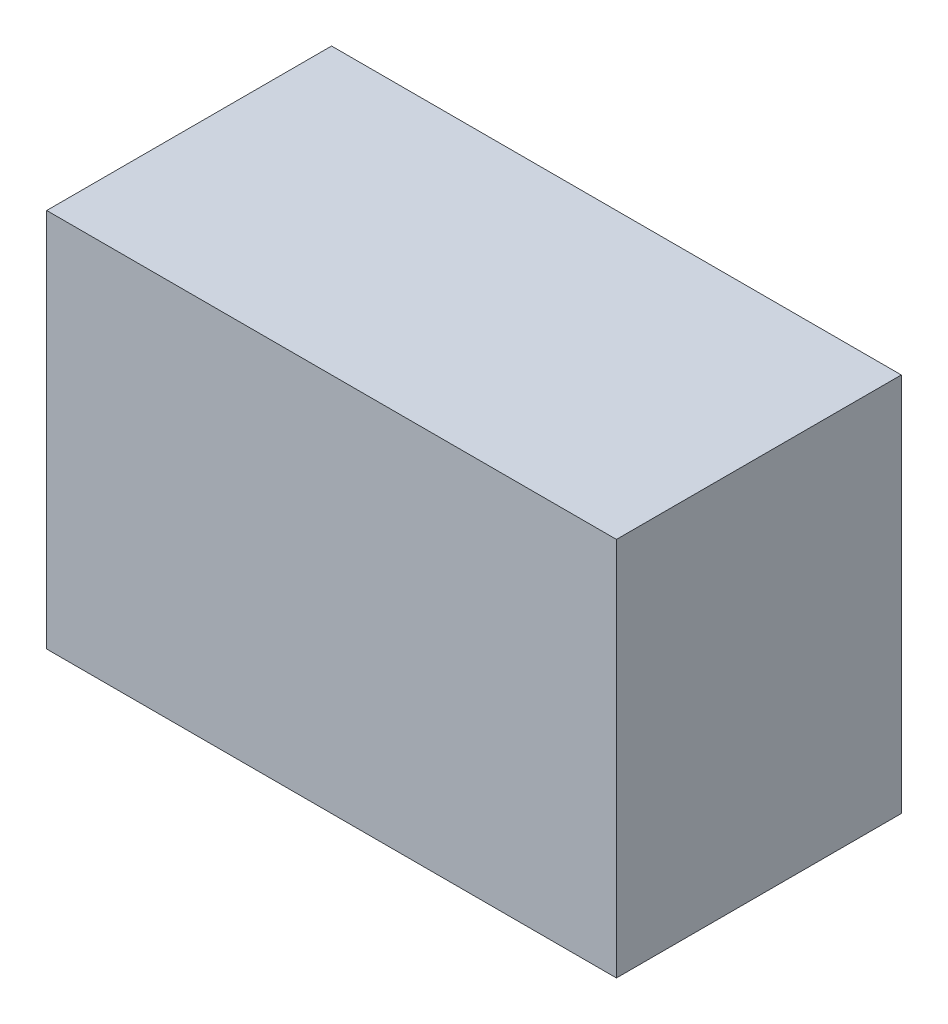
ISO-10303-21;
HEADER;
FILE_DESCRIPTION(('STEP AP214'),'2;1');
FILE_NAME('part.step','',(''),(''),'','','');
FILE_SCHEMA(('AUTOMOTIVE_DESIGN { 1 0 10303 214 1 1 1 1 }'));
ENDSEC;
DATA;
#1=APPLICATION_CONTEXT('core data for automotive mechanical design processes');
#2=APPLICATION_PROTOCOL_DEFINITION('international standard','automotive_design',2000,#1);
#3=PRODUCT_CONTEXT('',#1,'mechanical');
#4=PRODUCT('Part','Part','',(#3));
#5=PRODUCT_RELATED_PRODUCT_CATEGORY('part','',(#4));
#6=PRODUCT_DEFINITION_FORMATION('','',#4);
#7=PRODUCT_DEFINITION_CONTEXT('part definition',#1,'design');
#8=PRODUCT_DEFINITION('design','',#6,#7);
#9=PRODUCT_DEFINITION_SHAPE('','',#8);
#10=(LENGTH_UNIT() NAMED_UNIT(*) SI_UNIT(.MILLI.,.METRE.));
#11=(NAMED_UNIT(*) PLANE_ANGLE_UNIT() SI_UNIT($,.RADIAN.));
#12=(NAMED_UNIT(*) SI_UNIT($,.STERADIAN.) SOLID_ANGLE_UNIT());
#13=UNCERTAINTY_MEASURE_WITH_UNIT(LENGTH_MEASURE(1.E-05),#10,'distance_accuracy_value','');
#14=(GEOMETRIC_REPRESENTATION_CONTEXT(3) GLOBAL_UNCERTAINTY_ASSIGNED_CONTEXT((#13)) GLOBAL_UNIT_ASSIGNED_CONTEXT((#10,
#11,#12)) REPRESENTATION_CONTEXT('',''));
#15=CARTESIAN_POINT('',(0.,0.,0.));
#16=DIRECTION('',(0.,0.,1.));
#17=DIRECTION('',(1.,0.,0.));
#18=AXIS2_PLACEMENT_3D('',#15,#16,#17);
#19=CARTESIAN_POINT('',(0.,0.,3.));
#20=DIRECTION('',(1.,0.,0.));
#21=DIRECTION('',(0.,0.,-1.));
#22=AXIS2_PLACEMENT_3D('',#19,#20,#21);
#23=PLANE('',#22);
#24=DIRECTION('',(0.,-1.,0.));
#25=VECTOR('',#24,1.);
#26=CARTESIAN_POINT('',(0.,0.,0.));
#27=LINE('',#26,#25);
#28=CARTESIAN_POINT('',(0.,4.,0.));
#29=VERTEX_POINT('',#28);
#30=CARTESIAN_POINT('',(0.,0.,0.));
#31=VERTEX_POINT('',#30);
#32=EDGE_CURVE('E107',#29,#31,#27,.T.);
#33=ORIENTED_EDGE('',*,*,#32,.T.);
#34=DIRECTION('',(0.,0.,-1.));
#35=VECTOR('',#34,1.);
#36=CARTESIAN_POINT('',(0.,0.,3.));
#37=LINE('',#36,#35);
#38=CARTESIAN_POINT('',(0.,0.,3.));
#39=VERTEX_POINT('',#38);
#40=EDGE_CURVE('E11',#39,#31,#37,.T.);
#41=ORIENTED_EDGE('',*,*,#40,.F.);
#42=DIRECTION('',(0.,-1.,0.));
#43=VECTOR('',#42,1.);
#44=CARTESIAN_POINT('',(0.,0.,3.));
#45=LINE('',#44,#43);
#46=CARTESIAN_POINT('',(0.,4.,3.));
#47=VERTEX_POINT('',#46);
#48=EDGE_CURVE('E91',#47,#39,#45,.T.);
#49=ORIENTED_EDGE('',*,*,#48,.F.);
#50=DIRECTION('',(0.,0.,-1.));
#51=VECTOR('',#50,1.);
#52=CARTESIAN_POINT('',(0.,4.,3.));
#53=LINE('',#52,#51);
#54=EDGE_CURVE('E103',#47,#29,#53,.T.);
#55=ORIENTED_EDGE('',*,*,#54,.T.);
#56=EDGE_LOOP('',(#33,#41,#49,#55));
#57=FACE_BOUND('',#56,.T.);
#58=ADVANCED_FACE('F39',(#57),#23,.F.);
#59=CARTESIAN_POINT('',(0.,0.,3.));
#60=DIRECTION('',(0.,1.,0.));
#61=DIRECTION('',(0.,0.,1.));
#62=AXIS2_PLACEMENT_3D('',#59,#60,#61);
#63=PLANE('',#62);
#64=DIRECTION('',(1.,0.,0.));
#65=VECTOR('',#64,1.);
#66=CARTESIAN_POINT('',(0.,0.,0.));
#67=LINE('',#66,#65);
#68=CARTESIAN_POINT('',(6.,0.,0.));
#69=VERTEX_POINT('',#68);
#70=EDGE_CURVE('E96',#31,#69,#67,.T.);
#71=ORIENTED_EDGE('',*,*,#70,.T.);
#72=DIRECTION('',(0.,0.,-1.));
#73=VECTOR('',#72,1.);
#74=CARTESIAN_POINT('',(6.,0.,3.));
#75=LINE('',#74,#73);
#76=CARTESIAN_POINT('',(6.,0.,3.));
#77=VERTEX_POINT('',#76);
#78=EDGE_CURVE('E48',#77,#69,#75,.T.);
#79=ORIENTED_EDGE('',*,*,#78,.F.);
#80=DIRECTION('',(1.,0.,0.));
#81=VECTOR('',#80,1.);
#82=CARTESIAN_POINT('',(0.,0.,3.));
#83=LINE('',#82,#81);
#84=EDGE_CURVE('E86',#39,#77,#83,.T.);
#85=ORIENTED_EDGE('',*,*,#84,.F.);
#86=ORIENTED_EDGE('',*,*,#40,.T.);
#87=EDGE_LOOP('',(#71,#79,#85,#86));
#88=FACE_BOUND('',#87,.T.);
#89=ADVANCED_FACE('F95',(#88),#63,.F.);
#90=CARTESIAN_POINT('',(6.,0.,3.));
#91=DIRECTION('',(-1.,0.,0.));
#92=DIRECTION('',(0.,0.,1.));
#93=AXIS2_PLACEMENT_3D('',#90,#91,#92);
#94=PLANE('',#93);
#95=DIRECTION('',(0.,1.,0.));
#96=VECTOR('',#95,1.);
#97=CARTESIAN_POINT('',(6.,0.,0.));
#98=LINE('',#97,#96);
#99=CARTESIAN_POINT('',(6.,4.,0.));
#100=VERTEX_POINT('',#99);
#101=EDGE_CURVE('E73',#69,#100,#98,.T.);
#102=ORIENTED_EDGE('',*,*,#101,.T.);
#103=DIRECTION('',(0.,0.,-1.));
#104=VECTOR('',#103,1.);
#105=CARTESIAN_POINT('',(6.,4.,3.));
#106=LINE('',#105,#104);
#107=CARTESIAN_POINT('',(6.,4.,3.));
#108=VERTEX_POINT('',#107);
#109=EDGE_CURVE('E98',#108,#100,#106,.T.);
#110=ORIENTED_EDGE('',*,*,#109,.F.);
#111=DIRECTION('',(0.,1.,0.));
#112=VECTOR('',#111,1.);
#113=CARTESIAN_POINT('',(6.,0.,3.));
#114=LINE('',#113,#112);
#115=EDGE_CURVE('E89',#77,#108,#114,.T.);
#116=ORIENTED_EDGE('',*,*,#115,.F.);
#117=ORIENTED_EDGE('',*,*,#78,.T.);
#118=EDGE_LOOP('',(#102,#110,#116,#117));
#119=FACE_BOUND('',#118,.T.);
#120=ADVANCED_FACE('F99',(#119),#94,.F.);
#121=CARTESIAN_POINT('',(0.,4.,3.));
#122=DIRECTION('',(0.,-1.,0.));
#123=DIRECTION('',(0.,0.,-1.));
#124=AXIS2_PLACEMENT_3D('',#121,#122,#123);
#125=PLANE('',#124);
#126=DIRECTION('',(-1.,0.,0.));
#127=VECTOR('',#126,1.);
#128=CARTESIAN_POINT('',(0.,4.,0.));
#129=LINE('',#128,#127);
#130=EDGE_CURVE('E79',#100,#29,#129,.T.);
#131=ORIENTED_EDGE('',*,*,#130,.T.);
#132=ORIENTED_EDGE('',*,*,#54,.F.);
#133=DIRECTION('',(-1.,0.,0.));
#134=VECTOR('',#133,1.);
#135=CARTESIAN_POINT('',(0.,4.,3.));
#136=LINE('',#135,#134);
#137=EDGE_CURVE('E56',#108,#47,#136,.T.);
#138=ORIENTED_EDGE('',*,*,#137,.F.);
#139=ORIENTED_EDGE('',*,*,#109,.T.);
#140=EDGE_LOOP('',(#131,#132,#138,#139));
#141=FACE_BOUND('',#140,.T.);
#142=ADVANCED_FACE('F120',(#141),#125,.F.);
#143=CARTESIAN_POINT('',(0.,0.,3.));
#144=DIRECTION('',(0.,0.,-1.));
#145=DIRECTION('',(-1.,0.,0.));
#146=AXIS2_PLACEMENT_3D('',#143,#144,#145);
#147=PLANE('',#146);
#148=ORIENTED_EDGE('',*,*,#48,.T.);
#149=ORIENTED_EDGE('',*,*,#84,.T.);
#150=ORIENTED_EDGE('',*,*,#115,.T.);
#151=ORIENTED_EDGE('',*,*,#137,.T.);
#152=EDGE_LOOP('',(#148,#149,#150,#151));
#153=FACE_BOUND('',#152,.T.);
#154=ADVANCED_FACE('F87',(#153),#147,.F.);
#155=CARTESIAN_POINT('',(0.,0.,0.));
#156=DIRECTION('',(0.,0.,-1.));
#157=DIRECTION('',(-1.,0.,0.));
#158=AXIS2_PLACEMENT_3D('',#155,#156,#157);
#159=PLANE('',#158);
#160=ORIENTED_EDGE('',*,*,#32,.F.);
#161=ORIENTED_EDGE('',*,*,#130,.F.);
#162=ORIENTED_EDGE('',*,*,#101,.F.);
#163=ORIENTED_EDGE('',*,*,#70,.F.);
#164=EDGE_LOOP('',(#160,#161,#162,#163));
#165=FACE_BOUND('',#164,.T.);
#166=ADVANCED_FACE('F123',(#165),#159,.T.);
#167=CLOSED_SHELL('',(#58,#89,#120,#142,#154,#166));
#168=MANIFOLD_SOLID_BREP('B2',#167);
#169=ADVANCED_BREP_SHAPE_REPRESENTATION('',(#18,#168),#14);
#170=SHAPE_DEFINITION_REPRESENTATION(#9,#169);
ENDSEC;
END-ISO-10303-21;
